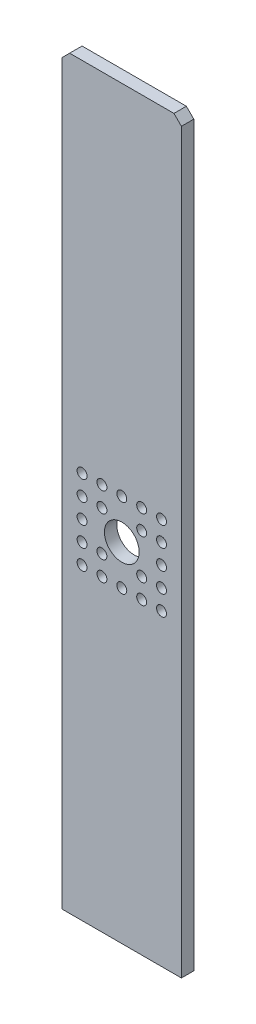
ISO-10303-21;
HEADER;
FILE_DESCRIPTION(('STEP AP214'),'2;1');
FILE_NAME('part.step','',(''),(''),'','','');
FILE_SCHEMA(('AUTOMOTIVE_DESIGN { 1 0 10303 214 1 1 1 1 }'));
ENDSEC;
DATA;
#1=APPLICATION_CONTEXT('core data for automotive mechanical design processes');
#2=APPLICATION_PROTOCOL_DEFINITION('international standard','automotive_design',2000,#1);
#3=PRODUCT_CONTEXT('',#1,'mechanical');
#4=PRODUCT('Part','Part','',(#3));
#5=PRODUCT_RELATED_PRODUCT_CATEGORY('part','',(#4));
#6=PRODUCT_DEFINITION_FORMATION('','',#4);
#7=PRODUCT_DEFINITION_CONTEXT('part definition',#1,'design');
#8=PRODUCT_DEFINITION('design','',#6,#7);
#9=PRODUCT_DEFINITION_SHAPE('','',#8);
#10=(LENGTH_UNIT() NAMED_UNIT(*) SI_UNIT(.MILLI.,.METRE.));
#11=(NAMED_UNIT(*) PLANE_ANGLE_UNIT() SI_UNIT($,.RADIAN.));
#12=(NAMED_UNIT(*) SI_UNIT($,.STERADIAN.) SOLID_ANGLE_UNIT());
#13=UNCERTAINTY_MEASURE_WITH_UNIT(LENGTH_MEASURE(1.E-05),#10,'distance_accuracy_value','');
#14=(GEOMETRIC_REPRESENTATION_CONTEXT(3) GLOBAL_UNCERTAINTY_ASSIGNED_CONTEXT((#13)) GLOBAL_UNIT_ASSIGNED_CONTEXT((#10,
#11,#12)) REPRESENTATION_CONTEXT('',''));
#15=CARTESIAN_POINT('',(0.,0.,0.));
#16=DIRECTION('',(0.,0.,1.));
#17=DIRECTION('',(1.,0.,0.));
#18=AXIS2_PLACEMENT_3D('',#15,#16,#17);
#19=CARTESIAN_POINT('',(0.,0.,5.));
#20=DIRECTION('',(0.,0.,1.));
#21=DIRECTION('',(1.,0.,0.));
#22=AXIS2_PLACEMENT_3D('',#19,#20,#21);
#23=PLANE('',#22);
#24=CARTESIAN_POINT('',(8.00000000000027,-168.,5.));
#25=DIRECTION('',(0.,0.,1.));
#26=DIRECTION('',(1.,0.,0.));
#27=AXIS2_PLACEMENT_3D('',#24,#25,#26);
#28=CIRCLE('',#27,2.);
#29=CARTESIAN_POINT('',(10.0000000000003,-168.,5.));
#30=VERTEX_POINT('',#29);
#31=EDGE_CURVE('E290',#30,#30,#28,.T.);
#32=ORIENTED_EDGE('',*,*,#31,.F.);
#33=EDGE_LOOP('',(#32));
#34=FACE_BOUND('',#33,.T.);
#35=CARTESIAN_POINT('',(8.0000000000001,-152.,5.));
#36=DIRECTION('',(0.,0.,1.));
#37=DIRECTION('',(1.,0.,0.));
#38=AXIS2_PLACEMENT_3D('',#35,#36,#37);
#39=CIRCLE('',#38,2.);
#40=CARTESIAN_POINT('',(10.0000000000001,-152.,5.));
#41=VERTEX_POINT('',#40);
#42=EDGE_CURVE('E306',#41,#41,#39,.T.);
#43=ORIENTED_EDGE('',*,*,#42,.F.);
#44=EDGE_LOOP('',(#43));
#45=FACE_BOUND('',#44,.T.);
#46=CARTESIAN_POINT('',(32.0000000000003,-176.,5.));
#47=DIRECTION('',(0.,0.,1.));
#48=DIRECTION('',(1.,0.,0.));
#49=AXIS2_PLACEMENT_3D('',#46,#47,#48);
#50=CIRCLE('',#49,2.);
#51=CARTESIAN_POINT('',(34.0000000000003,-176.,5.));
#52=VERTEX_POINT('',#51);
#53=EDGE_CURVE('E322',#52,#52,#50,.T.);
#54=ORIENTED_EDGE('',*,*,#53,.F.);
#55=EDGE_LOOP('',(#54));
#56=FACE_BOUND('',#55,.T.);
#57=CARTESIAN_POINT('',(16.0000000000003,-176.,5.));
#58=DIRECTION('',(0.,0.,1.));
#59=DIRECTION('',(1.,0.,0.));
#60=AXIS2_PLACEMENT_3D('',#57,#58,#59);
#61=CIRCLE('',#60,2.);
#62=CARTESIAN_POINT('',(18.0000000000003,-176.,5.));
#63=VERTEX_POINT('',#62);
#64=EDGE_CURVE('E338',#63,#63,#61,.T.);
#65=ORIENTED_EDGE('',*,*,#64,.F.);
#66=EDGE_LOOP('',(#65));
#67=FACE_BOUND('',#66,.T.);
#68=CARTESIAN_POINT('',(32.0000000000003,-168.,5.));
#69=DIRECTION('',(0.,0.,1.));
#70=DIRECTION('',(1.,0.,0.));
#71=AXIS2_PLACEMENT_3D('',#68,#69,#70);
#72=CIRCLE('',#71,2.);
#73=CARTESIAN_POINT('',(34.0000000000003,-168.,5.));
#74=VERTEX_POINT('',#73);
#75=EDGE_CURVE('E354',#74,#74,#72,.T.);
#76=ORIENTED_EDGE('',*,*,#75,.F.);
#77=EDGE_LOOP('',(#76));
#78=FACE_BOUND('',#77,.T.);
#79=CARTESIAN_POINT('',(40.0000000000002,-160.,5.));
#80=DIRECTION('',(0.,0.,1.));
#81=DIRECTION('',(1.,0.,0.));
#82=AXIS2_PLACEMENT_3D('',#79,#80,#81);
#83=CIRCLE('',#82,2.);
#84=CARTESIAN_POINT('',(42.0000000000002,-160.,5.));
#85=VERTEX_POINT('',#84);
#86=EDGE_CURVE('E370',#85,#85,#83,.T.);
#87=ORIENTED_EDGE('',*,*,#86,.F.);
#88=EDGE_LOOP('',(#87));
#89=FACE_BOUND('',#88,.T.);
#90=CARTESIAN_POINT('',(32.0000000000001,-152.,5.));
#91=DIRECTION('',(0.,0.,1.));
#92=DIRECTION('',(1.,0.,0.));
#93=AXIS2_PLACEMENT_3D('',#90,#91,#92);
#94=CIRCLE('',#93,2.);
#95=CARTESIAN_POINT('',(34.0000000000001,-152.,5.));
#96=VERTEX_POINT('',#95);
#97=EDGE_CURVE('E386',#96,#96,#94,.T.);
#98=ORIENTED_EDGE('',*,*,#97,.F.);
#99=EDGE_LOOP('',(#98));
#100=FACE_BOUND('',#99,.T.);
#101=CARTESIAN_POINT('',(40.,-144.,5.));
#102=DIRECTION('',(0.,0.,1.));
#103=DIRECTION('',(1.,0.,0.));
#104=AXIS2_PLACEMENT_3D('',#101,#102,#103);
#105=CIRCLE('',#104,2.);
#106=CARTESIAN_POINT('',(42.,-144.,5.));
#107=VERTEX_POINT('',#106);
#108=EDGE_CURVE('E402',#107,#107,#105,.T.);
#109=ORIENTED_EDGE('',*,*,#108,.F.);
#110=EDGE_LOOP('',(#109));
#111=FACE_BOUND('',#110,.T.);
#112=CARTESIAN_POINT('',(24.,-144.,5.));
#113=DIRECTION('',(0.,0.,1.));
#114=DIRECTION('',(1.,0.,0.));
#115=AXIS2_PLACEMENT_3D('',#112,#113,#114);
#116=CIRCLE('',#115,2.00000000000001);
#117=CARTESIAN_POINT('',(26.,-144.,5.));
#118=VERTEX_POINT('',#117);
#119=EDGE_CURVE('E418',#118,#118,#116,.T.);
#120=ORIENTED_EDGE('',*,*,#119,.F.);
#121=EDGE_LOOP('',(#120));
#122=FACE_BOUND('',#121,.T.);
#123=CARTESIAN_POINT('',(8.00000000000002,-144.,5.));
#124=DIRECTION('',(0.,0.,1.));
#125=DIRECTION('',(1.,0.,0.));
#126=AXIS2_PLACEMENT_3D('',#123,#124,#125);
#127=CIRCLE('',#126,1.99999999999999);
#128=CARTESIAN_POINT('',(10.,-144.,5.));
#129=VERTEX_POINT('',#128);
#130=EDGE_CURVE('E434',#129,#129,#127,.T.);
#131=ORIENTED_EDGE('',*,*,#130,.F.);
#132=EDGE_LOOP('',(#131));
#133=FACE_BOUND('',#132,.T.);
#134=DIRECTION('',(-1.,0.,0.));
#135=VECTOR('',#134,1.);
#136=CARTESIAN_POINT('',(48.,0.,5.));
#137=LINE('',#136,#135);
#138=CARTESIAN_POINT('',(45.,0.,5.));
#139=VERTEX_POINT('',#138);
#140=CARTESIAN_POINT('',(3.,0.,5.));
#141=VERTEX_POINT('',#140);
#142=EDGE_CURVE('E108',#139,#141,#137,.T.);
#143=ORIENTED_EDGE('',*,*,#142,.T.);
#144=DIRECTION('',(0.707106781186547,0.707106781186548,0.));
#145=VECTOR('',#144,1.);
#146=CARTESIAN_POINT('',(1.5,-1.5,5.));
#147=LINE('',#146,#145);
#148=CARTESIAN_POINT('',(0.,-3.,5.));
#149=VERTEX_POINT('',#148);
#150=EDGE_CURVE('E51',#141,#149,#147,.F.);
#151=ORIENTED_EDGE('',*,*,#150,.T.);
#152=DIRECTION('',(0.,-1.,0.));
#153=VECTOR('',#152,1.);
#154=CARTESIAN_POINT('',(0.,0.,5.));
#155=LINE('',#154,#153);
#156=CARTESIAN_POINT('',(0.,-300.,5.));
#157=VERTEX_POINT('',#156);
#158=EDGE_CURVE('E97',#149,#157,#155,.T.);
#159=ORIENTED_EDGE('',*,*,#158,.T.);
#160=DIRECTION('',(1.,0.,0.));
#161=VECTOR('',#160,1.);
#162=CARTESIAN_POINT('',(0.,-300.,5.));
#163=LINE('',#162,#161);
#164=CARTESIAN_POINT('',(48.,-300.,5.));
#165=VERTEX_POINT('',#164);
#166=EDGE_CURVE('E101',#157,#165,#163,.T.);
#167=ORIENTED_EDGE('',*,*,#166,.T.);
#168=DIRECTION('',(0.,1.,0.));
#169=VECTOR('',#168,1.);
#170=CARTESIAN_POINT('',(48.,-300.,5.));
#171=LINE('',#170,#169);
#172=CARTESIAN_POINT('',(48.,-3.00000000000006,5.));
#173=VERTEX_POINT('',#172);
#174=EDGE_CURVE('E124',#165,#173,#171,.T.);
#175=ORIENTED_EDGE('',*,*,#174,.T.);
#176=DIRECTION('',(0.707106781186544,-0.707106781186551,0.));
#177=VECTOR('',#176,1.);
#178=CARTESIAN_POINT('',(22.5000000000002,22.5,5.));
#179=LINE('',#178,#177);
#180=EDGE_CURVE('E158',#173,#139,#179,.F.);
#181=ORIENTED_EDGE('',*,*,#180,.T.);
#182=EDGE_LOOP('',(#143,#151,#159,#167,#175,#181));
#183=FACE_BOUND('',#182,.T.);
#184=CARTESIAN_POINT('',(24.,-160.,5.));
#185=DIRECTION('',(0.,0.,1.));
#186=DIRECTION('',(1.,0.,0.));
#187=AXIS2_PLACEMENT_3D('',#184,#185,#186);
#188=CIRCLE('',#187,6.99999999999999);
#189=CARTESIAN_POINT('',(31.,-160.,5.));
#190=VERTEX_POINT('',#189);
#191=EDGE_CURVE('E133',#190,#190,#188,.T.);
#192=ORIENTED_EDGE('',*,*,#191,.F.);
#193=EDGE_LOOP('',(#192));
#194=FACE_BOUND('',#193,.T.);
#195=CARTESIAN_POINT('',(16.,-144.,5.));
#196=DIRECTION('',(0.,0.,1.));
#197=DIRECTION('',(1.,0.,0.));
#198=AXIS2_PLACEMENT_3D('',#195,#196,#197);
#199=CIRCLE('',#198,2.);
#200=CARTESIAN_POINT('',(18.,-144.,5.));
#201=VERTEX_POINT('',#200);
#202=EDGE_CURVE('E426',#201,#201,#199,.T.);
#203=ORIENTED_EDGE('',*,*,#202,.F.);
#204=EDGE_LOOP('',(#203));
#205=FACE_BOUND('',#204,.T.);
#206=CARTESIAN_POINT('',(32.,-144.,5.));
#207=DIRECTION('',(0.,0.,1.));
#208=DIRECTION('',(1.,0.,0.));
#209=AXIS2_PLACEMENT_3D('',#206,#207,#208);
#210=CIRCLE('',#209,2.);
#211=CARTESIAN_POINT('',(34.,-144.,5.));
#212=VERTEX_POINT('',#211);
#213=EDGE_CURVE('E410',#212,#212,#210,.T.);
#214=ORIENTED_EDGE('',*,*,#213,.F.);
#215=EDGE_LOOP('',(#214));
#216=FACE_BOUND('',#215,.T.);
#217=CARTESIAN_POINT('',(16.0000000000001,-152.,5.));
#218=DIRECTION('',(0.,0.,1.));
#219=DIRECTION('',(1.,0.,0.));
#220=AXIS2_PLACEMENT_3D('',#217,#218,#219);
#221=CIRCLE('',#220,2.);
#222=CARTESIAN_POINT('',(18.0000000000001,-152.,5.));
#223=VERTEX_POINT('',#222);
#224=EDGE_CURVE('E394',#223,#223,#221,.T.);
#225=ORIENTED_EDGE('',*,*,#224,.F.);
#226=EDGE_LOOP('',(#225));
#227=FACE_BOUND('',#226,.T.);
#228=CARTESIAN_POINT('',(40.0000000000001,-152.,5.));
#229=DIRECTION('',(0.,0.,1.));
#230=DIRECTION('',(1.,0.,0.));
#231=AXIS2_PLACEMENT_3D('',#228,#229,#230);
#232=CIRCLE('',#231,2.);
#233=CARTESIAN_POINT('',(42.0000000000001,-152.,5.));
#234=VERTEX_POINT('',#233);
#235=EDGE_CURVE('E378',#234,#234,#232,.T.);
#236=ORIENTED_EDGE('',*,*,#235,.F.);
#237=EDGE_LOOP('',(#236));
#238=FACE_BOUND('',#237,.T.);
#239=CARTESIAN_POINT('',(16.0000000000003,-168.,5.));
#240=DIRECTION('',(0.,0.,1.));
#241=DIRECTION('',(1.,0.,0.));
#242=AXIS2_PLACEMENT_3D('',#239,#240,#241);
#243=CIRCLE('',#242,2.);
#244=CARTESIAN_POINT('',(18.0000000000003,-168.,5.));
#245=VERTEX_POINT('',#244);
#246=EDGE_CURVE('E362',#245,#245,#243,.T.);
#247=ORIENTED_EDGE('',*,*,#246,.F.);
#248=EDGE_LOOP('',(#247));
#249=FACE_BOUND('',#248,.T.);
#250=CARTESIAN_POINT('',(40.0000000000003,-168.,5.));
#251=DIRECTION('',(0.,0.,1.));
#252=DIRECTION('',(1.,0.,0.));
#253=AXIS2_PLACEMENT_3D('',#250,#251,#252);
#254=CIRCLE('',#253,2.);
#255=CARTESIAN_POINT('',(42.0000000000003,-168.,5.));
#256=VERTEX_POINT('',#255);
#257=EDGE_CURVE('E346',#256,#256,#254,.T.);
#258=ORIENTED_EDGE('',*,*,#257,.F.);
#259=EDGE_LOOP('',(#258));
#260=FACE_BOUND('',#259,.T.);
#261=CARTESIAN_POINT('',(24.0000000000003,-176.,5.));
#262=DIRECTION('',(0.,0.,1.));
#263=DIRECTION('',(1.,0.,0.));
#264=AXIS2_PLACEMENT_3D('',#261,#262,#263);
#265=CIRCLE('',#264,2.00000000000001);
#266=CARTESIAN_POINT('',(26.0000000000004,-176.,5.));
#267=VERTEX_POINT('',#266);
#268=EDGE_CURVE('E330',#267,#267,#265,.T.);
#269=ORIENTED_EDGE('',*,*,#268,.F.);
#270=EDGE_LOOP('',(#269));
#271=FACE_BOUND('',#270,.T.);
#272=CARTESIAN_POINT('',(40.0000000000003,-176.,5.));
#273=DIRECTION('',(0.,0.,1.));
#274=DIRECTION('',(1.,0.,0.));
#275=AXIS2_PLACEMENT_3D('',#272,#273,#274);
#276=CIRCLE('',#275,2.);
#277=CARTESIAN_POINT('',(42.0000000000003,-176.,5.));
#278=VERTEX_POINT('',#277);
#279=EDGE_CURVE('E314',#278,#278,#276,.T.);
#280=ORIENTED_EDGE('',*,*,#279,.F.);
#281=EDGE_LOOP('',(#280));
#282=FACE_BOUND('',#281,.T.);
#283=CARTESIAN_POINT('',(8.00000000000018,-160.,5.));
#284=DIRECTION('',(0.,0.,1.));
#285=DIRECTION('',(1.,0.,0.));
#286=AXIS2_PLACEMENT_3D('',#283,#284,#285);
#287=CIRCLE('',#286,2.);
#288=CARTESIAN_POINT('',(10.0000000000002,-160.,5.));
#289=VERTEX_POINT('',#288);
#290=EDGE_CURVE('E298',#289,#289,#287,.T.);
#291=ORIENTED_EDGE('',*,*,#290,.F.);
#292=EDGE_LOOP('',(#291));
#293=FACE_BOUND('',#292,.T.);
#294=CARTESIAN_POINT('',(8.00000000000035,-176.,5.));
#295=DIRECTION('',(0.,0.,1.));
#296=DIRECTION('',(1.,0.,0.));
#297=AXIS2_PLACEMENT_3D('',#294,#295,#296);
#298=CIRCLE('',#297,2.);
#299=CARTESIAN_POINT('',(10.0000000000003,-176.,5.));
#300=VERTEX_POINT('',#299);
#301=EDGE_CURVE('E279',#300,#300,#298,.T.);
#302=ORIENTED_EDGE('',*,*,#301,.F.);
#303=EDGE_LOOP('',(#302));
#304=FACE_BOUND('',#303,.T.);
#305=ADVANCED_FACE('F41',(#34,#45,#56,#67,#78,#89,#100,#111,#122,#133,#183,#194,#205,#216,#227,
#238,#249,#260,#271,#282,#293,#304),#23,.T.);
#306=CARTESIAN_POINT('',(0.,0.,0.));
#307=DIRECTION('',(0.,0.,1.));
#308=DIRECTION('',(1.,0.,0.));
#309=AXIS2_PLACEMENT_3D('',#306,#307,#308);
#310=PLANE('',#309);
#311=DIRECTION('',(0.,-1.,0.));
#312=VECTOR('',#311,1.);
#313=CARTESIAN_POINT('',(0.,0.,0.));
#314=LINE('',#313,#312);
#315=CARTESIAN_POINT('',(0.,-3.,0.));
#316=VERTEX_POINT('',#315);
#317=CARTESIAN_POINT('',(0.,-300.,0.));
#318=VERTEX_POINT('',#317);
#319=EDGE_CURVE('E114',#316,#318,#314,.T.);
#320=ORIENTED_EDGE('',*,*,#319,.F.);
#321=DIRECTION('',(-0.707106781186547,-0.707106781186548,0.));
#322=VECTOR('',#321,1.);
#323=CARTESIAN_POINT('',(0.,-3.,0.));
#324=LINE('',#323,#322);
#325=CARTESIAN_POINT('',(3.,0.,0.));
#326=VERTEX_POINT('',#325);
#327=EDGE_CURVE('E149',#316,#326,#324,.F.);
#328=ORIENTED_EDGE('',*,*,#327,.T.);
#329=DIRECTION('',(-1.,0.,0.));
#330=VECTOR('',#329,1.);
#331=CARTESIAN_POINT('',(48.,0.,0.));
#332=LINE('',#331,#330);
#333=CARTESIAN_POINT('',(45.,0.,0.));
#334=VERTEX_POINT('',#333);
#335=EDGE_CURVE('E130',#334,#326,#332,.T.);
#336=ORIENTED_EDGE('',*,*,#335,.F.);
#337=DIRECTION('',(-0.707106781186544,0.707106781186551,0.));
#338=VECTOR('',#337,1.);
#339=CARTESIAN_POINT('',(45.,0.,0.));
#340=LINE('',#339,#338);
#341=CARTESIAN_POINT('',(48.,-3.00000000000006,0.));
#342=VERTEX_POINT('',#341);
#343=EDGE_CURVE('E146',#334,#342,#340,.F.);
#344=ORIENTED_EDGE('',*,*,#343,.T.);
#345=DIRECTION('',(0.,1.,0.));
#346=VECTOR('',#345,1.);
#347=CARTESIAN_POINT('',(48.,-300.,0.));
#348=LINE('',#347,#346);
#349=CARTESIAN_POINT('',(48.,-300.,0.));
#350=VERTEX_POINT('',#349);
#351=EDGE_CURVE('E139',#350,#342,#348,.T.);
#352=ORIENTED_EDGE('',*,*,#351,.F.);
#353=DIRECTION('',(1.,0.,0.));
#354=VECTOR('',#353,1.);
#355=CARTESIAN_POINT('',(0.,-300.,0.));
#356=LINE('',#355,#354);
#357=EDGE_CURVE('E136',#318,#350,#356,.T.);
#358=ORIENTED_EDGE('',*,*,#357,.F.);
#359=EDGE_LOOP('',(#320,#328,#336,#344,#352,#358));
#360=FACE_BOUND('',#359,.T.);
#361=CARTESIAN_POINT('',(24.,-160.,0.));
#362=DIRECTION('',(0.,0.,1.));
#363=DIRECTION('',(1.,0.,0.));
#364=AXIS2_PLACEMENT_3D('',#361,#362,#363);
#365=CIRCLE('',#364,6.99999999999999);
#366=CARTESIAN_POINT('',(31.,-160.,0.));
#367=VERTEX_POINT('',#366);
#368=EDGE_CURVE('E438',#367,#367,#365,.T.);
#369=ORIENTED_EDGE('',*,*,#368,.T.);
#370=EDGE_LOOP('',(#369));
#371=FACE_BOUND('',#370,.T.);
#372=CARTESIAN_POINT('',(8.00000000000002,-144.,0.));
#373=DIRECTION('',(0.,0.,1.));
#374=DIRECTION('',(1.,0.,0.));
#375=AXIS2_PLACEMENT_3D('',#372,#373,#374);
#376=CIRCLE('',#375,1.99999999999999);
#377=CARTESIAN_POINT('',(10.,-144.,0.));
#378=VERTEX_POINT('',#377);
#379=EDGE_CURVE('E430',#378,#378,#376,.T.);
#380=ORIENTED_EDGE('',*,*,#379,.T.);
#381=EDGE_LOOP('',(#380));
#382=FACE_BOUND('',#381,.T.);
#383=CARTESIAN_POINT('',(16.,-144.,0.));
#384=DIRECTION('',(0.,0.,1.));
#385=DIRECTION('',(1.,0.,0.));
#386=AXIS2_PLACEMENT_3D('',#383,#384,#385);
#387=CIRCLE('',#386,2.);
#388=CARTESIAN_POINT('',(18.,-144.,0.));
#389=VERTEX_POINT('',#388);
#390=EDGE_CURVE('E422',#389,#389,#387,.T.);
#391=ORIENTED_EDGE('',*,*,#390,.T.);
#392=EDGE_LOOP('',(#391));
#393=FACE_BOUND('',#392,.T.);
#394=CARTESIAN_POINT('',(24.,-144.,0.));
#395=DIRECTION('',(0.,0.,1.));
#396=DIRECTION('',(1.,0.,0.));
#397=AXIS2_PLACEMENT_3D('',#394,#395,#396);
#398=CIRCLE('',#397,2.00000000000001);
#399=CARTESIAN_POINT('',(26.,-144.,0.));
#400=VERTEX_POINT('',#399);
#401=EDGE_CURVE('E414',#400,#400,#398,.T.);
#402=ORIENTED_EDGE('',*,*,#401,.T.);
#403=EDGE_LOOP('',(#402));
#404=FACE_BOUND('',#403,.T.);
#405=CARTESIAN_POINT('',(32.,-144.,0.));
#406=DIRECTION('',(0.,0.,1.));
#407=DIRECTION('',(1.,0.,0.));
#408=AXIS2_PLACEMENT_3D('',#405,#406,#407);
#409=CIRCLE('',#408,2.);
#410=CARTESIAN_POINT('',(34.,-144.,0.));
#411=VERTEX_POINT('',#410);
#412=EDGE_CURVE('E406',#411,#411,#409,.T.);
#413=ORIENTED_EDGE('',*,*,#412,.T.);
#414=EDGE_LOOP('',(#413));
#415=FACE_BOUND('',#414,.T.);
#416=CARTESIAN_POINT('',(40.,-144.,0.));
#417=DIRECTION('',(0.,0.,1.));
#418=DIRECTION('',(1.,0.,0.));
#419=AXIS2_PLACEMENT_3D('',#416,#417,#418);
#420=CIRCLE('',#419,2.);
#421=CARTESIAN_POINT('',(42.,-144.,0.));
#422=VERTEX_POINT('',#421);
#423=EDGE_CURVE('E398',#422,#422,#420,.T.);
#424=ORIENTED_EDGE('',*,*,#423,.T.);
#425=EDGE_LOOP('',(#424));
#426=FACE_BOUND('',#425,.T.);
#427=CARTESIAN_POINT('',(16.0000000000001,-152.,0.));
#428=DIRECTION('',(0.,0.,1.));
#429=DIRECTION('',(1.,0.,0.));
#430=AXIS2_PLACEMENT_3D('',#427,#428,#429);
#431=CIRCLE('',#430,2.);
#432=CARTESIAN_POINT('',(18.0000000000001,-152.,0.));
#433=VERTEX_POINT('',#432);
#434=EDGE_CURVE('E390',#433,#433,#431,.T.);
#435=ORIENTED_EDGE('',*,*,#434,.T.);
#436=EDGE_LOOP('',(#435));
#437=FACE_BOUND('',#436,.T.);
#438=CARTESIAN_POINT('',(32.0000000000001,-152.,0.));
#439=DIRECTION('',(0.,0.,1.));
#440=DIRECTION('',(1.,0.,0.));
#441=AXIS2_PLACEMENT_3D('',#438,#439,#440);
#442=CIRCLE('',#441,2.);
#443=CARTESIAN_POINT('',(34.0000000000001,-152.,0.));
#444=VERTEX_POINT('',#443);
#445=EDGE_CURVE('E382',#444,#444,#442,.T.);
#446=ORIENTED_EDGE('',*,*,#445,.T.);
#447=EDGE_LOOP('',(#446));
#448=FACE_BOUND('',#447,.T.);
#449=CARTESIAN_POINT('',(40.0000000000001,-152.,0.));
#450=DIRECTION('',(0.,0.,1.));
#451=DIRECTION('',(1.,0.,0.));
#452=AXIS2_PLACEMENT_3D('',#449,#450,#451);
#453=CIRCLE('',#452,2.);
#454=CARTESIAN_POINT('',(42.0000000000001,-152.,0.));
#455=VERTEX_POINT('',#454);
#456=EDGE_CURVE('E374',#455,#455,#453,.T.);
#457=ORIENTED_EDGE('',*,*,#456,.T.);
#458=EDGE_LOOP('',(#457));
#459=FACE_BOUND('',#458,.T.);
#460=CARTESIAN_POINT('',(40.0000000000002,-160.,0.));
#461=DIRECTION('',(0.,0.,1.));
#462=DIRECTION('',(1.,0.,0.));
#463=AXIS2_PLACEMENT_3D('',#460,#461,#462);
#464=CIRCLE('',#463,2.);
#465=CARTESIAN_POINT('',(42.0000000000002,-160.,0.));
#466=VERTEX_POINT('',#465);
#467=EDGE_CURVE('E366',#466,#466,#464,.T.);
#468=ORIENTED_EDGE('',*,*,#467,.T.);
#469=EDGE_LOOP('',(#468));
#470=FACE_BOUND('',#469,.T.);
#471=CARTESIAN_POINT('',(16.0000000000003,-168.,0.));
#472=DIRECTION('',(0.,0.,1.));
#473=DIRECTION('',(1.,0.,0.));
#474=AXIS2_PLACEMENT_3D('',#471,#472,#473);
#475=CIRCLE('',#474,2.);
#476=CARTESIAN_POINT('',(18.0000000000003,-168.,0.));
#477=VERTEX_POINT('',#476);
#478=EDGE_CURVE('E358',#477,#477,#475,.T.);
#479=ORIENTED_EDGE('',*,*,#478,.T.);
#480=EDGE_LOOP('',(#479));
#481=FACE_BOUND('',#480,.T.);
#482=CARTESIAN_POINT('',(32.0000000000003,-168.,0.));
#483=DIRECTION('',(0.,0.,1.));
#484=DIRECTION('',(1.,0.,0.));
#485=AXIS2_PLACEMENT_3D('',#482,#483,#484);
#486=CIRCLE('',#485,2.);
#487=CARTESIAN_POINT('',(34.0000000000003,-168.,0.));
#488=VERTEX_POINT('',#487);
#489=EDGE_CURVE('E350',#488,#488,#486,.T.);
#490=ORIENTED_EDGE('',*,*,#489,.T.);
#491=EDGE_LOOP('',(#490));
#492=FACE_BOUND('',#491,.T.);
#493=CARTESIAN_POINT('',(40.0000000000003,-168.,0.));
#494=DIRECTION('',(0.,0.,1.));
#495=DIRECTION('',(1.,0.,0.));
#496=AXIS2_PLACEMENT_3D('',#493,#494,#495);
#497=CIRCLE('',#496,2.);
#498=CARTESIAN_POINT('',(42.0000000000003,-168.,0.));
#499=VERTEX_POINT('',#498);
#500=EDGE_CURVE('E342',#499,#499,#497,.T.);
#501=ORIENTED_EDGE('',*,*,#500,.T.);
#502=EDGE_LOOP('',(#501));
#503=FACE_BOUND('',#502,.T.);
#504=CARTESIAN_POINT('',(16.0000000000003,-176.,0.));
#505=DIRECTION('',(0.,0.,1.));
#506=DIRECTION('',(1.,0.,0.));
#507=AXIS2_PLACEMENT_3D('',#504,#505,#506);
#508=CIRCLE('',#507,2.);
#509=CARTESIAN_POINT('',(18.0000000000003,-176.,0.));
#510=VERTEX_POINT('',#509);
#511=EDGE_CURVE('E334',#510,#510,#508,.T.);
#512=ORIENTED_EDGE('',*,*,#511,.T.);
#513=EDGE_LOOP('',(#512));
#514=FACE_BOUND('',#513,.T.);
#515=CARTESIAN_POINT('',(24.0000000000003,-176.,0.));
#516=DIRECTION('',(0.,0.,1.));
#517=DIRECTION('',(1.,0.,0.));
#518=AXIS2_PLACEMENT_3D('',#515,#516,#517);
#519=CIRCLE('',#518,2.00000000000001);
#520=CARTESIAN_POINT('',(26.0000000000004,-176.,0.));
#521=VERTEX_POINT('',#520);
#522=EDGE_CURVE('E326',#521,#521,#519,.T.);
#523=ORIENTED_EDGE('',*,*,#522,.T.);
#524=EDGE_LOOP('',(#523));
#525=FACE_BOUND('',#524,.T.);
#526=CARTESIAN_POINT('',(32.0000000000003,-176.,0.));
#527=DIRECTION('',(0.,0.,1.));
#528=DIRECTION('',(1.,0.,0.));
#529=AXIS2_PLACEMENT_3D('',#526,#527,#528);
#530=CIRCLE('',#529,2.);
#531=CARTESIAN_POINT('',(34.0000000000003,-176.,0.));
#532=VERTEX_POINT('',#531);
#533=EDGE_CURVE('E318',#532,#532,#530,.T.);
#534=ORIENTED_EDGE('',*,*,#533,.T.);
#535=EDGE_LOOP('',(#534));
#536=FACE_BOUND('',#535,.T.);
#537=CARTESIAN_POINT('',(40.0000000000003,-176.,0.));
#538=DIRECTION('',(0.,0.,1.));
#539=DIRECTION('',(1.,0.,0.));
#540=AXIS2_PLACEMENT_3D('',#537,#538,#539);
#541=CIRCLE('',#540,2.);
#542=CARTESIAN_POINT('',(42.0000000000003,-176.,0.));
#543=VERTEX_POINT('',#542);
#544=EDGE_CURVE('E310',#543,#543,#541,.T.);
#545=ORIENTED_EDGE('',*,*,#544,.T.);
#546=EDGE_LOOP('',(#545));
#547=FACE_BOUND('',#546,.T.);
#548=CARTESIAN_POINT('',(8.0000000000001,-152.,0.));
#549=DIRECTION('',(0.,0.,1.));
#550=DIRECTION('',(1.,0.,0.));
#551=AXIS2_PLACEMENT_3D('',#548,#549,#550);
#552=CIRCLE('',#551,2.);
#553=CARTESIAN_POINT('',(10.0000000000001,-152.,0.));
#554=VERTEX_POINT('',#553);
#555=EDGE_CURVE('E302',#554,#554,#552,.T.);
#556=ORIENTED_EDGE('',*,*,#555,.T.);
#557=EDGE_LOOP('',(#556));
#558=FACE_BOUND('',#557,.T.);
#559=CARTESIAN_POINT('',(8.00000000000018,-160.,0.));
#560=DIRECTION('',(0.,0.,1.));
#561=DIRECTION('',(1.,0.,0.));
#562=AXIS2_PLACEMENT_3D('',#559,#560,#561);
#563=CIRCLE('',#562,2.);
#564=CARTESIAN_POINT('',(10.0000000000002,-160.,0.));
#565=VERTEX_POINT('',#564);
#566=EDGE_CURVE('E294',#565,#565,#563,.T.);
#567=ORIENTED_EDGE('',*,*,#566,.T.);
#568=EDGE_LOOP('',(#567));
#569=FACE_BOUND('',#568,.T.);
#570=CARTESIAN_POINT('',(8.00000000000027,-168.,0.));
#571=DIRECTION('',(0.,0.,1.));
#572=DIRECTION('',(1.,0.,0.));
#573=AXIS2_PLACEMENT_3D('',#570,#571,#572);
#574=CIRCLE('',#573,2.);
#575=CARTESIAN_POINT('',(10.0000000000003,-168.,0.));
#576=VERTEX_POINT('',#575);
#577=EDGE_CURVE('E287',#576,#576,#574,.T.);
#578=ORIENTED_EDGE('',*,*,#577,.T.);
#579=EDGE_LOOP('',(#578));
#580=FACE_BOUND('',#579,.T.);
#581=CARTESIAN_POINT('',(8.00000000000035,-176.,0.));
#582=DIRECTION('',(0.,0.,1.));
#583=DIRECTION('',(1.,0.,0.));
#584=AXIS2_PLACEMENT_3D('',#581,#582,#583);
#585=CIRCLE('',#584,2.);
#586=CARTESIAN_POINT('',(10.0000000000003,-176.,0.));
#587=VERTEX_POINT('',#586);
#588=EDGE_CURVE('E282',#587,#587,#585,.T.);
#589=ORIENTED_EDGE('',*,*,#588,.T.);
#590=EDGE_LOOP('',(#589));
#591=FACE_BOUND('',#590,.T.);
#592=ADVANCED_FACE('F169',(#360,#371,#382,#393,#404,#415,#426,#437,#448,#459,#470,#481,#492,
#503,#514,#525,#536,#547,#558,#569,#580,#591),#310,.F.);
#593=CARTESIAN_POINT('',(48.,0.,5.));
#594=DIRECTION('',(0.,-1.,0.));
#595=DIRECTION('',(0.,0.,-1.));
#596=AXIS2_PLACEMENT_3D('',#593,#594,#595);
#597=PLANE('',#596);
#598=ORIENTED_EDGE('',*,*,#335,.T.);
#599=DIRECTION('',(0.,0.,1.));
#600=VECTOR('',#599,1.);
#601=CARTESIAN_POINT('',(3.,0.,5.));
#602=LINE('',#601,#600);
#603=EDGE_CURVE('E64',#326,#141,#602,.T.);
#604=ORIENTED_EDGE('',*,*,#603,.T.);
#605=ORIENTED_EDGE('',*,*,#142,.F.);
#606=DIRECTION('',(0.,0.,-1.));
#607=VECTOR('',#606,1.);
#608=CARTESIAN_POINT('',(45.,0.,5.));
#609=LINE('',#608,#607);
#610=EDGE_CURVE('E152',#139,#334,#609,.T.);
#611=ORIENTED_EDGE('',*,*,#610,.T.);
#612=EDGE_LOOP('',(#598,#604,#605,#611));
#613=FACE_BOUND('',#612,.T.);
#614=ADVANCED_FACE('F164',(#613),#597,.F.);
#615=CARTESIAN_POINT('',(0.,0.,5.));
#616=DIRECTION('',(1.,0.,0.));
#617=DIRECTION('',(0.,1.,0.));
#618=AXIS2_PLACEMENT_3D('',#615,#616,#617);
#619=PLANE('',#618);
#620=ORIENTED_EDGE('',*,*,#158,.F.);
#621=DIRECTION('',(0.,0.,-1.));
#622=VECTOR('',#621,1.);
#623=CARTESIAN_POINT('',(0.,-3.,5.));
#624=LINE('',#623,#622);
#625=EDGE_CURVE('E118',#149,#316,#624,.T.);
#626=ORIENTED_EDGE('',*,*,#625,.T.);
#627=ORIENTED_EDGE('',*,*,#319,.T.);
#628=DIRECTION('',(0.,0.,-1.));
#629=VECTOR('',#628,1.);
#630=CARTESIAN_POINT('',(0.,-300.,5.));
#631=LINE('',#630,#629);
#632=EDGE_CURVE('E111',#157,#318,#631,.T.);
#633=ORIENTED_EDGE('',*,*,#632,.F.);
#634=EDGE_LOOP('',(#620,#626,#627,#633));
#635=FACE_BOUND('',#634,.T.);
#636=ADVANCED_FACE('F112',(#635),#619,.F.);
#637=CARTESIAN_POINT('',(0.,-300.,5.));
#638=DIRECTION('',(0.,1.,0.));
#639=DIRECTION('',(0.,0.,1.));
#640=AXIS2_PLACEMENT_3D('',#637,#638,#639);
#641=PLANE('',#640);
#642=ORIENTED_EDGE('',*,*,#357,.T.);
#643=DIRECTION('',(0.,0.,-1.));
#644=VECTOR('',#643,1.);
#645=CARTESIAN_POINT('',(48.,-300.,5.));
#646=LINE('',#645,#644);
#647=EDGE_CURVE('E119',#165,#350,#646,.T.);
#648=ORIENTED_EDGE('',*,*,#647,.F.);
#649=ORIENTED_EDGE('',*,*,#166,.F.);
#650=ORIENTED_EDGE('',*,*,#632,.T.);
#651=EDGE_LOOP('',(#642,#648,#649,#650));
#652=FACE_BOUND('',#651,.T.);
#653=ADVANCED_FACE('F121',(#652),#641,.F.);
#654=CARTESIAN_POINT('',(48.,-300.,5.));
#655=DIRECTION('',(-1.,0.,0.));
#656=DIRECTION('',(0.,0.,1.));
#657=AXIS2_PLACEMENT_3D('',#654,#655,#656);
#658=PLANE('',#657);
#659=ORIENTED_EDGE('',*,*,#351,.T.);
#660=DIRECTION('',(0.,0.,1.));
#661=VECTOR('',#660,1.);
#662=CARTESIAN_POINT('',(48.,-3.00000000000006,5.));
#663=LINE('',#662,#661);
#664=EDGE_CURVE('E11',#342,#173,#663,.T.);
#665=ORIENTED_EDGE('',*,*,#664,.T.);
#666=ORIENTED_EDGE('',*,*,#174,.F.);
#667=ORIENTED_EDGE('',*,*,#647,.T.);
#668=EDGE_LOOP('',(#659,#665,#666,#667));
#669=FACE_BOUND('',#668,.T.);
#670=ADVANCED_FACE('F171',(#669),#658,.F.);
#671=CARTESIAN_POINT('',(24.,-160.,5.));
#672=DIRECTION('',(0.,0.,-1.));
#673=DIRECTION('',(-1.,0.,0.));
#674=AXIS2_PLACEMENT_3D('',#671,#672,#673);
#675=CYLINDRICAL_SURFACE('',#674,6.99999999999999);
#676=ORIENTED_EDGE('',*,*,#191,.T.);
#677=EDGE_LOOP('',(#676));
#678=FACE_BOUND('',#677,.T.);
#679=ORIENTED_EDGE('',*,*,#368,.F.);
#680=EDGE_LOOP('',(#679));
#681=FACE_BOUND('',#680,.T.);
#682=ADVANCED_FACE('F173',(#678,#681),#675,.F.);
#683=CARTESIAN_POINT('',(8.00000000000002,-144.,5.));
#684=DIRECTION('',(0.,0.,-1.));
#685=DIRECTION('',(-1.,0.,0.));
#686=AXIS2_PLACEMENT_3D('',#683,#684,#685);
#687=CYLINDRICAL_SURFACE('',#686,1.99999999999999);
#688=ORIENTED_EDGE('',*,*,#130,.T.);
#689=EDGE_LOOP('',(#688));
#690=FACE_BOUND('',#689,.T.);
#691=ORIENTED_EDGE('',*,*,#379,.F.);
#692=EDGE_LOOP('',(#691));
#693=FACE_BOUND('',#692,.T.);
#694=ADVANCED_FACE('F179',(#690,#693),#687,.F.);
#695=CARTESIAN_POINT('',(16.,-144.,5.));
#696=DIRECTION('',(0.,0.,-1.));
#697=DIRECTION('',(-1.,0.,0.));
#698=AXIS2_PLACEMENT_3D('',#695,#696,#697);
#699=CYLINDRICAL_SURFACE('',#698,2.);
#700=ORIENTED_EDGE('',*,*,#202,.T.);
#701=EDGE_LOOP('',(#700));
#702=FACE_BOUND('',#701,.T.);
#703=ORIENTED_EDGE('',*,*,#390,.F.);
#704=EDGE_LOOP('',(#703));
#705=FACE_BOUND('',#704,.T.);
#706=ADVANCED_FACE('F195',(#702,#705),#699,.F.);
#707=CARTESIAN_POINT('',(24.,-144.,5.));
#708=DIRECTION('',(0.,0.,-1.));
#709=DIRECTION('',(-1.,0.,0.));
#710=AXIS2_PLACEMENT_3D('',#707,#708,#709);
#711=CYLINDRICAL_SURFACE('',#710,2.00000000000001);
#712=ORIENTED_EDGE('',*,*,#119,.T.);
#713=EDGE_LOOP('',(#712));
#714=FACE_BOUND('',#713,.T.);
#715=ORIENTED_EDGE('',*,*,#401,.F.);
#716=EDGE_LOOP('',(#715));
#717=FACE_BOUND('',#716,.T.);
#718=ADVANCED_FACE('F199',(#714,#717),#711,.F.);
#719=CARTESIAN_POINT('',(32.,-144.,5.));
#720=DIRECTION('',(0.,0.,-1.));
#721=DIRECTION('',(-1.,0.,0.));
#722=AXIS2_PLACEMENT_3D('',#719,#720,#721);
#723=CYLINDRICAL_SURFACE('',#722,2.);
#724=ORIENTED_EDGE('',*,*,#213,.T.);
#725=EDGE_LOOP('',(#724));
#726=FACE_BOUND('',#725,.T.);
#727=ORIENTED_EDGE('',*,*,#412,.F.);
#728=EDGE_LOOP('',(#727));
#729=FACE_BOUND('',#728,.T.);
#730=ADVANCED_FACE('F203',(#726,#729),#723,.F.);
#731=CARTESIAN_POINT('',(40.,-144.,5.));
#732=DIRECTION('',(0.,0.,-1.));
#733=DIRECTION('',(-1.,0.,0.));
#734=AXIS2_PLACEMENT_3D('',#731,#732,#733);
#735=CYLINDRICAL_SURFACE('',#734,2.);
#736=ORIENTED_EDGE('',*,*,#108,.T.);
#737=EDGE_LOOP('',(#736));
#738=FACE_BOUND('',#737,.T.);
#739=ORIENTED_EDGE('',*,*,#423,.F.);
#740=EDGE_LOOP('',(#739));
#741=FACE_BOUND('',#740,.T.);
#742=ADVANCED_FACE('F207',(#738,#741),#735,.F.);
#743=CARTESIAN_POINT('',(16.0000000000001,-152.,5.));
#744=DIRECTION('',(0.,0.,-1.));
#745=DIRECTION('',(-1.,0.,0.));
#746=AXIS2_PLACEMENT_3D('',#743,#744,#745);
#747=CYLINDRICAL_SURFACE('',#746,2.);
#748=ORIENTED_EDGE('',*,*,#224,.T.);
#749=EDGE_LOOP('',(#748));
#750=FACE_BOUND('',#749,.T.);
#751=ORIENTED_EDGE('',*,*,#434,.F.);
#752=EDGE_LOOP('',(#751));
#753=FACE_BOUND('',#752,.T.);
#754=ADVANCED_FACE('F211',(#750,#753),#747,.F.);
#755=CARTESIAN_POINT('',(32.0000000000001,-152.,5.));
#756=DIRECTION('',(0.,0.,-1.));
#757=DIRECTION('',(-1.,0.,0.));
#758=AXIS2_PLACEMENT_3D('',#755,#756,#757);
#759=CYLINDRICAL_SURFACE('',#758,2.);
#760=ORIENTED_EDGE('',*,*,#97,.T.);
#761=EDGE_LOOP('',(#760));
#762=FACE_BOUND('',#761,.T.);
#763=ORIENTED_EDGE('',*,*,#445,.F.);
#764=EDGE_LOOP('',(#763));
#765=FACE_BOUND('',#764,.T.);
#766=ADVANCED_FACE('F215',(#762,#765),#759,.F.);
#767=CARTESIAN_POINT('',(40.0000000000001,-152.,5.));
#768=DIRECTION('',(0.,0.,-1.));
#769=DIRECTION('',(-1.,0.,0.));
#770=AXIS2_PLACEMENT_3D('',#767,#768,#769);
#771=CYLINDRICAL_SURFACE('',#770,2.);
#772=ORIENTED_EDGE('',*,*,#235,.T.);
#773=EDGE_LOOP('',(#772));
#774=FACE_BOUND('',#773,.T.);
#775=ORIENTED_EDGE('',*,*,#456,.F.);
#776=EDGE_LOOP('',(#775));
#777=FACE_BOUND('',#776,.T.);
#778=ADVANCED_FACE('F219',(#774,#777),#771,.F.);
#779=CARTESIAN_POINT('',(40.0000000000002,-160.,5.));
#780=DIRECTION('',(0.,0.,-1.));
#781=DIRECTION('',(-1.,0.,0.));
#782=AXIS2_PLACEMENT_3D('',#779,#780,#781);
#783=CYLINDRICAL_SURFACE('',#782,2.);
#784=ORIENTED_EDGE('',*,*,#86,.T.);
#785=EDGE_LOOP('',(#784));
#786=FACE_BOUND('',#785,.T.);
#787=ORIENTED_EDGE('',*,*,#467,.F.);
#788=EDGE_LOOP('',(#787));
#789=FACE_BOUND('',#788,.T.);
#790=ADVANCED_FACE('F223',(#786,#789),#783,.F.);
#791=CARTESIAN_POINT('',(16.0000000000003,-168.,5.));
#792=DIRECTION('',(0.,0.,-1.));
#793=DIRECTION('',(-1.,0.,0.));
#794=AXIS2_PLACEMENT_3D('',#791,#792,#793);
#795=CYLINDRICAL_SURFACE('',#794,2.);
#796=ORIENTED_EDGE('',*,*,#246,.T.);
#797=EDGE_LOOP('',(#796));
#798=FACE_BOUND('',#797,.T.);
#799=ORIENTED_EDGE('',*,*,#478,.F.);
#800=EDGE_LOOP('',(#799));
#801=FACE_BOUND('',#800,.T.);
#802=ADVANCED_FACE('F227',(#798,#801),#795,.F.);
#803=CARTESIAN_POINT('',(32.0000000000003,-168.,5.));
#804=DIRECTION('',(0.,0.,-1.));
#805=DIRECTION('',(-1.,0.,0.));
#806=AXIS2_PLACEMENT_3D('',#803,#804,#805);
#807=CYLINDRICAL_SURFACE('',#806,2.);
#808=ORIENTED_EDGE('',*,*,#75,.T.);
#809=EDGE_LOOP('',(#808));
#810=FACE_BOUND('',#809,.T.);
#811=ORIENTED_EDGE('',*,*,#489,.F.);
#812=EDGE_LOOP('',(#811));
#813=FACE_BOUND('',#812,.T.);
#814=ADVANCED_FACE('F231',(#810,#813),#807,.F.);
#815=CARTESIAN_POINT('',(40.0000000000003,-168.,5.));
#816=DIRECTION('',(0.,0.,-1.));
#817=DIRECTION('',(-1.,0.,0.));
#818=AXIS2_PLACEMENT_3D('',#815,#816,#817);
#819=CYLINDRICAL_SURFACE('',#818,2.);
#820=ORIENTED_EDGE('',*,*,#257,.T.);
#821=EDGE_LOOP('',(#820));
#822=FACE_BOUND('',#821,.T.);
#823=ORIENTED_EDGE('',*,*,#500,.F.);
#824=EDGE_LOOP('',(#823));
#825=FACE_BOUND('',#824,.T.);
#826=ADVANCED_FACE('F235',(#822,#825),#819,.F.);
#827=CARTESIAN_POINT('',(16.0000000000003,-176.,5.));
#828=DIRECTION('',(0.,0.,-1.));
#829=DIRECTION('',(-1.,0.,0.));
#830=AXIS2_PLACEMENT_3D('',#827,#828,#829);
#831=CYLINDRICAL_SURFACE('',#830,2.);
#832=ORIENTED_EDGE('',*,*,#64,.T.);
#833=EDGE_LOOP('',(#832));
#834=FACE_BOUND('',#833,.T.);
#835=ORIENTED_EDGE('',*,*,#511,.F.);
#836=EDGE_LOOP('',(#835));
#837=FACE_BOUND('',#836,.T.);
#838=ADVANCED_FACE('F239',(#834,#837),#831,.F.);
#839=CARTESIAN_POINT('',(24.0000000000003,-176.,5.));
#840=DIRECTION('',(0.,0.,-1.));
#841=DIRECTION('',(-1.,0.,0.));
#842=AXIS2_PLACEMENT_3D('',#839,#840,#841);
#843=CYLINDRICAL_SURFACE('',#842,2.00000000000001);
#844=ORIENTED_EDGE('',*,*,#268,.T.);
#845=EDGE_LOOP('',(#844));
#846=FACE_BOUND('',#845,.T.);
#847=ORIENTED_EDGE('',*,*,#522,.F.);
#848=EDGE_LOOP('',(#847));
#849=FACE_BOUND('',#848,.T.);
#850=ADVANCED_FACE('F243',(#846,#849),#843,.F.);
#851=CARTESIAN_POINT('',(32.0000000000003,-176.,5.));
#852=DIRECTION('',(0.,0.,-1.));
#853=DIRECTION('',(-1.,0.,0.));
#854=AXIS2_PLACEMENT_3D('',#851,#852,#853);
#855=CYLINDRICAL_SURFACE('',#854,2.);
#856=ORIENTED_EDGE('',*,*,#53,.T.);
#857=EDGE_LOOP('',(#856));
#858=FACE_BOUND('',#857,.T.);
#859=ORIENTED_EDGE('',*,*,#533,.F.);
#860=EDGE_LOOP('',(#859));
#861=FACE_BOUND('',#860,.T.);
#862=ADVANCED_FACE('F247',(#858,#861),#855,.F.);
#863=CARTESIAN_POINT('',(40.0000000000003,-176.,5.));
#864=DIRECTION('',(0.,0.,-1.));
#865=DIRECTION('',(-1.,0.,0.));
#866=AXIS2_PLACEMENT_3D('',#863,#864,#865);
#867=CYLINDRICAL_SURFACE('',#866,2.);
#868=ORIENTED_EDGE('',*,*,#279,.T.);
#869=EDGE_LOOP('',(#868));
#870=FACE_BOUND('',#869,.T.);
#871=ORIENTED_EDGE('',*,*,#544,.F.);
#872=EDGE_LOOP('',(#871));
#873=FACE_BOUND('',#872,.T.);
#874=ADVANCED_FACE('F251',(#870,#873),#867,.F.);
#875=CARTESIAN_POINT('',(8.0000000000001,-152.,5.));
#876=DIRECTION('',(0.,0.,-1.));
#877=DIRECTION('',(-1.,0.,0.));
#878=AXIS2_PLACEMENT_3D('',#875,#876,#877);
#879=CYLINDRICAL_SURFACE('',#878,2.);
#880=ORIENTED_EDGE('',*,*,#42,.T.);
#881=EDGE_LOOP('',(#880));
#882=FACE_BOUND('',#881,.T.);
#883=ORIENTED_EDGE('',*,*,#555,.F.);
#884=EDGE_LOOP('',(#883));
#885=FACE_BOUND('',#884,.T.);
#886=ADVANCED_FACE('F255',(#882,#885),#879,.F.);
#887=CARTESIAN_POINT('',(8.00000000000018,-160.,5.));
#888=DIRECTION('',(0.,0.,-1.));
#889=DIRECTION('',(-1.,0.,0.));
#890=AXIS2_PLACEMENT_3D('',#887,#888,#889);
#891=CYLINDRICAL_SURFACE('',#890,2.);
#892=ORIENTED_EDGE('',*,*,#290,.T.);
#893=EDGE_LOOP('',(#892));
#894=FACE_BOUND('',#893,.T.);
#895=ORIENTED_EDGE('',*,*,#566,.F.);
#896=EDGE_LOOP('',(#895));
#897=FACE_BOUND('',#896,.T.);
#898=ADVANCED_FACE('F259',(#894,#897),#891,.F.);
#899=CARTESIAN_POINT('',(8.00000000000027,-168.,5.));
#900=DIRECTION('',(0.,0.,-1.));
#901=DIRECTION('',(-1.,0.,0.));
#902=AXIS2_PLACEMENT_3D('',#899,#900,#901);
#903=CYLINDRICAL_SURFACE('',#902,2.);
#904=ORIENTED_EDGE('',*,*,#31,.T.);
#905=EDGE_LOOP('',(#904));
#906=FACE_BOUND('',#905,.T.);
#907=ORIENTED_EDGE('',*,*,#577,.F.);
#908=EDGE_LOOP('',(#907));
#909=FACE_BOUND('',#908,.T.);
#910=ADVANCED_FACE('F263',(#906,#909),#903,.F.);
#911=CARTESIAN_POINT('',(8.00000000000035,-176.,5.));
#912=DIRECTION('',(0.,0.,-1.));
#913=DIRECTION('',(-1.,0.,0.));
#914=AXIS2_PLACEMENT_3D('',#911,#912,#913);
#915=CYLINDRICAL_SURFACE('',#914,2.);
#916=ORIENTED_EDGE('',*,*,#301,.T.);
#917=EDGE_LOOP('',(#916));
#918=FACE_BOUND('',#917,.T.);
#919=ORIENTED_EDGE('',*,*,#588,.F.);
#920=EDGE_LOOP('',(#919));
#921=FACE_BOUND('',#920,.T.);
#922=ADVANCED_FACE('F267',(#918,#921),#915,.F.);
#923=CARTESIAN_POINT('',(0.,-3.,5.));
#924=DIRECTION('',(0.707106781186547,-0.707106781186547,0.));
#925=DIRECTION('',(0.,0.,-1.));
#926=AXIS2_PLACEMENT_3D('',#923,#924,#925);
#927=PLANE('',#926);
#928=ORIENTED_EDGE('',*,*,#150,.F.);
#929=ORIENTED_EDGE('',*,*,#603,.F.);
#930=ORIENTED_EDGE('',*,*,#327,.F.);
#931=ORIENTED_EDGE('',*,*,#625,.F.);
#932=EDGE_LOOP('',(#928,#929,#930,#931));
#933=FACE_BOUND('',#932,.T.);
#934=ADVANCED_FACE('F270',(#933),#927,.F.);
#935=CARTESIAN_POINT('',(45.,0.,5.));
#936=DIRECTION('',(-0.707106781186551,-0.707106781186544,0.));
#937=DIRECTION('',(0.,0.,-1.));
#938=AXIS2_PLACEMENT_3D('',#935,#936,#937);
#939=PLANE('',#938);
#940=ORIENTED_EDGE('',*,*,#180,.F.);
#941=ORIENTED_EDGE('',*,*,#664,.F.);
#942=ORIENTED_EDGE('',*,*,#343,.F.);
#943=ORIENTED_EDGE('',*,*,#610,.F.);
#944=EDGE_LOOP('',(#940,#941,#942,#943));
#945=FACE_BOUND('',#944,.T.);
#946=ADVANCED_FACE('F44',(#945),#939,.F.);
#947=CLOSED_SHELL('',(#305,#592,#614,#636,#653,#670,#682,#694,#706,#718,#730,#742,#754,#766,
#778,#790,#802,#814,#826,#838,#850,#862,#874,#886,#898,#910,#922,#934,#946));
#948=MANIFOLD_SOLID_BREP('B2',#947);
#949=ADVANCED_BREP_SHAPE_REPRESENTATION('',(#18,#948),#14);
#950=SHAPE_DEFINITION_REPRESENTATION(#9,#949);
ENDSEC;
END-ISO-10303-21;
